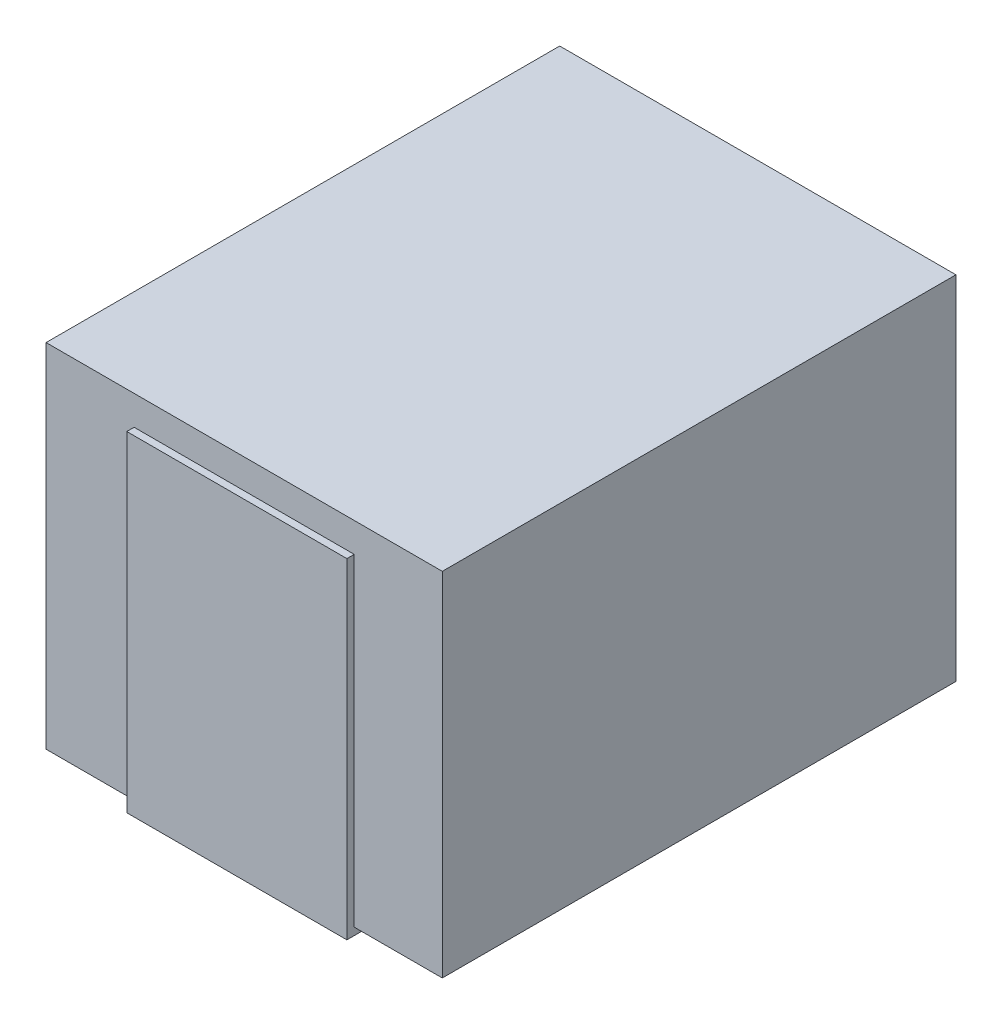
ISO-10303-21;
HEADER;
FILE_DESCRIPTION(('STEP AP214'),'2;1');
FILE_NAME('part.step','',(''),(''),'','','');
FILE_SCHEMA(('AUTOMOTIVE_DESIGN { 1 0 10303 214 1 1 1 1 }'));
ENDSEC;
DATA;
#1=APPLICATION_CONTEXT('core data for automotive mechanical design processes');
#2=APPLICATION_PROTOCOL_DEFINITION('international standard','automotive_design',2000,#1);
#3=PRODUCT_CONTEXT('',#1,'mechanical');
#4=PRODUCT('Part','Part','',(#3));
#5=PRODUCT_RELATED_PRODUCT_CATEGORY('part','',(#4));
#6=PRODUCT_DEFINITION_FORMATION('','',#4);
#7=PRODUCT_DEFINITION_CONTEXT('part definition',#1,'design');
#8=PRODUCT_DEFINITION('design','',#6,#7);
#9=PRODUCT_DEFINITION_SHAPE('','',#8);
#10=(LENGTH_UNIT() NAMED_UNIT(*) SI_UNIT(.MILLI.,.METRE.));
#11=(NAMED_UNIT(*) PLANE_ANGLE_UNIT() SI_UNIT($,.RADIAN.));
#12=(NAMED_UNIT(*) SI_UNIT($,.STERADIAN.) SOLID_ANGLE_UNIT());
#13=UNCERTAINTY_MEASURE_WITH_UNIT(LENGTH_MEASURE(1.E-05),#10,'distance_accuracy_value','');
#14=(GEOMETRIC_REPRESENTATION_CONTEXT(3) GLOBAL_UNCERTAINTY_ASSIGNED_CONTEXT((#13)) GLOBAL_UNIT_ASSIGNED_CONTEXT((#10,
#11,#12)) REPRESENTATION_CONTEXT('',''));
#15=CARTESIAN_POINT('',(0.,0.,0.));
#16=DIRECTION('',(0.,0.,1.));
#17=DIRECTION('',(1.,0.,0.));
#18=AXIS2_PLACEMENT_3D('',#15,#16,#17);
#19=CARTESIAN_POINT('',(0.75,2.2,1.8));
#20=DIRECTION('',(0.,0.,-1.));
#21=DIRECTION('',(-1.,0.,0.));
#22=AXIS2_PLACEMENT_3D('',#19,#20,#21);
#23=PLANE('',#22);
#24=DIRECTION('',(1.,0.,0.));
#25=VECTOR('',#24,1.);
#26=CARTESIAN_POINT('',(0.75,-0.05,1.8));
#27=LINE('',#26,#25);
#28=CARTESIAN_POINT('',(-0.75,-0.0500000000000001,1.8));
#29=VERTEX_POINT('',#28);
#30=CARTESIAN_POINT('',(0.75,-0.0500000000000001,1.8));
#31=VERTEX_POINT('',#30);
#32=EDGE_CURVE('E20',#29,#31,#27,.T.);
#33=ORIENTED_EDGE('',*,*,#32,.T.);
#34=DIRECTION('',(0.,1.,0.));
#35=VECTOR('',#34,1.);
#36=CARTESIAN_POINT('',(0.75,0.,1.8));
#37=LINE('',#36,#35);
#38=CARTESIAN_POINT('',(0.75,2.2,1.8));
#39=VERTEX_POINT('',#38);
#40=EDGE_CURVE('E120',#39,#31,#37,.F.);
#41=ORIENTED_EDGE('',*,*,#40,.F.);
#42=DIRECTION('',(1.,0.,0.));
#43=VECTOR('',#42,1.);
#44=CARTESIAN_POINT('',(0.75,2.2,1.8));
#45=LINE('',#44,#43);
#46=CARTESIAN_POINT('',(-0.75,2.2,1.8));
#47=VERTEX_POINT('',#46);
#48=EDGE_CURVE('E108',#39,#47,#45,.F.);
#49=ORIENTED_EDGE('',*,*,#48,.T.);
#50=DIRECTION('',(0.,1.,0.));
#51=VECTOR('',#50,1.);
#52=CARTESIAN_POINT('',(-0.75,0.,1.8));
#53=LINE('',#52,#51);
#54=EDGE_CURVE('E160',#47,#29,#53,.F.);
#55=ORIENTED_EDGE('',*,*,#54,.T.);
#56=EDGE_LOOP('',(#33,#41,#49,#55));
#57=FACE_BOUND('',#56,.T.);
#58=ADVANCED_FACE('F17',(#57),#23,.F.);
#59=CARTESIAN_POINT('',(0.75,-0.05,1.75));
#60=DIRECTION('',(0.,1.,0.));
#61=DIRECTION('',(0.,0.,1.));
#62=AXIS2_PLACEMENT_3D('',#59,#60,#61);
#63=PLANE('',#62);
#64=DIRECTION('',(1.,0.,0.));
#65=VECTOR('',#64,1.);
#66=CARTESIAN_POINT('',(0.75,-0.05,-1.8));
#67=LINE('',#66,#65);
#68=CARTESIAN_POINT('',(-0.75,-0.05,-1.8));
#69=VERTEX_POINT('',#68);
#70=CARTESIAN_POINT('',(0.75,-0.05,-1.8));
#71=VERTEX_POINT('',#70);
#72=EDGE_CURVE('E141',#69,#71,#67,.T.);
#73=ORIENTED_EDGE('',*,*,#72,.T.);
#74=DIRECTION('',(0.,0.,-1.));
#75=VECTOR('',#74,1.);
#76=CARTESIAN_POINT('',(0.75,-0.05,1.75));
#77=LINE('',#76,#75);
#78=EDGE_CURVE('E123',#31,#71,#77,.T.);
#79=ORIENTED_EDGE('',*,*,#78,.F.);
#80=ORIENTED_EDGE('',*,*,#32,.F.);
#81=DIRECTION('',(0.,0.,-1.));
#82=VECTOR('',#81,1.);
#83=CARTESIAN_POINT('',(-0.75,-0.05,1.75));
#84=LINE('',#83,#82);
#85=EDGE_CURVE('E147',#29,#69,#84,.T.);
#86=ORIENTED_EDGE('',*,*,#85,.T.);
#87=EDGE_LOOP('',(#73,#79,#80,#86));
#88=FACE_BOUND('',#87,.T.);
#89=ADVANCED_FACE('F145',(#88),#63,.F.);
#90=CARTESIAN_POINT('',(0.75,0.,-1.8));
#91=DIRECTION('',(0.,0.,1.));
#92=DIRECTION('',(1.,0.,0.));
#93=AXIS2_PLACEMENT_3D('',#90,#91,#92);
#94=PLANE('',#93);
#95=DIRECTION('',(1.,0.,0.));
#96=VECTOR('',#95,1.);
#97=CARTESIAN_POINT('',(0.75,2.2,-1.8));
#98=LINE('',#97,#96);
#99=CARTESIAN_POINT('',(-0.75,2.2,-1.8));
#100=VERTEX_POINT('',#99);
#101=CARTESIAN_POINT('',(0.75,2.2,-1.8));
#102=VERTEX_POINT('',#101);
#103=EDGE_CURVE('E133',#100,#102,#98,.T.);
#104=ORIENTED_EDGE('',*,*,#103,.T.);
#105=DIRECTION('',(0.,1.,0.));
#106=VECTOR('',#105,1.);
#107=CARTESIAN_POINT('',(0.75,0.,-1.8));
#108=LINE('',#107,#106);
#109=EDGE_CURVE('E151',#71,#102,#108,.T.);
#110=ORIENTED_EDGE('',*,*,#109,.F.);
#111=ORIENTED_EDGE('',*,*,#72,.F.);
#112=DIRECTION('',(0.,1.,0.));
#113=VECTOR('',#112,1.);
#114=CARTESIAN_POINT('',(-0.75,0.,-1.8));
#115=LINE('',#114,#113);
#116=EDGE_CURVE('E163',#69,#100,#115,.T.);
#117=ORIENTED_EDGE('',*,*,#116,.T.);
#118=EDGE_LOOP('',(#104,#110,#111,#117));
#119=FACE_BOUND('',#118,.T.);
#120=ADVANCED_FACE('F152',(#119),#94,.F.);
#121=CARTESIAN_POINT('',(-1.35,0.,1.75));
#122=DIRECTION('',(0.,1.,0.));
#123=DIRECTION('',(0.,0.,1.));
#124=AXIS2_PLACEMENT_3D('',#121,#122,#123);
#125=PLANE('',#124);
#126=DIRECTION('',(1.,0.,0.));
#127=VECTOR('',#126,1.);
#128=CARTESIAN_POINT('',(-1.35,0.,1.75));
#129=LINE('',#128,#127);
#130=CARTESIAN_POINT('',(-1.35,0.,1.75));
#131=VERTEX_POINT('',#130);
#132=CARTESIAN_POINT('',(-0.75,0.,1.75));
#133=VERTEX_POINT('',#132);
#134=EDGE_CURVE('E117',#131,#133,#129,.T.);
#135=ORIENTED_EDGE('',*,*,#134,.F.);
#136=DIRECTION('',(0.,0.,-1.));
#137=VECTOR('',#136,1.);
#138=CARTESIAN_POINT('',(-1.35,0.,-1.75));
#139=LINE('',#138,#137);
#140=CARTESIAN_POINT('',(-1.35,0.,-1.75));
#141=VERTEX_POINT('',#140);
#142=EDGE_CURVE('E170',#131,#141,#139,.T.);
#143=ORIENTED_EDGE('',*,*,#142,.T.);
#144=DIRECTION('',(1.,0.,0.));
#145=VECTOR('',#144,1.);
#146=CARTESIAN_POINT('',(-1.35,0.,-1.75));
#147=LINE('',#146,#145);
#148=CARTESIAN_POINT('',(-0.75,0.,-1.75));
#149=VERTEX_POINT('',#148);
#150=EDGE_CURVE('E140',#149,#141,#147,.F.);
#151=ORIENTED_EDGE('',*,*,#150,.F.);
#152=DIRECTION('',(0.,0.,-1.));
#153=VECTOR('',#152,1.);
#154=CARTESIAN_POINT('',(-0.75,0.,1.75));
#155=LINE('',#154,#153);
#156=EDGE_CURVE('E167',#149,#133,#155,.F.);
#157=ORIENTED_EDGE('',*,*,#156,.T.);
#158=EDGE_LOOP('',(#135,#143,#151,#157));
#159=FACE_BOUND('',#158,.T.);
#160=ADVANCED_FACE('F230',(#159),#125,.F.);
#161=CARTESIAN_POINT('',(0.75,2.2,1.55));
#162=DIRECTION('',(0.,-1.,0.));
#163=DIRECTION('',(0.,0.,-1.));
#164=AXIS2_PLACEMENT_3D('',#161,#162,#163);
#165=PLANE('',#164);
#166=DIRECTION('',(0.,0.,-1.));
#167=VECTOR('',#166,1.);
#168=CARTESIAN_POINT('',(-0.75,2.2,1.75));
#169=LINE('',#168,#167);
#170=CARTESIAN_POINT('',(-0.75,2.2,1.75));
#171=VERTEX_POINT('',#170);
#172=EDGE_CURVE('E114',#171,#47,#169,.F.);
#173=ORIENTED_EDGE('',*,*,#172,.T.);
#174=ORIENTED_EDGE('',*,*,#48,.F.);
#175=DIRECTION('',(0.,0.,-1.));
#176=VECTOR('',#175,1.);
#177=CARTESIAN_POINT('',(0.75,2.2,1.75));
#178=LINE('',#177,#176);
#179=CARTESIAN_POINT('',(0.75,2.2,1.75));
#180=VERTEX_POINT('',#179);
#181=EDGE_CURVE('E111',#180,#39,#178,.F.);
#182=ORIENTED_EDGE('',*,*,#181,.F.);
#183=DIRECTION('',(-1.,0.,0.));
#184=VECTOR('',#183,1.);
#185=CARTESIAN_POINT('',(-1.35,2.2,1.75));
#186=LINE('',#185,#184);
#187=EDGE_CURVE('E178',#180,#171,#186,.T.);
#188=ORIENTED_EDGE('',*,*,#187,.T.);
#189=EDGE_LOOP('',(#173,#174,#182,#188));
#190=FACE_BOUND('',#189,.T.);
#191=ADVANCED_FACE('F109',(#190),#165,.F.);
#192=CARTESIAN_POINT('',(-1.35,0.,1.75));
#193=DIRECTION('',(0.,1.,0.));
#194=DIRECTION('',(0.,0.,1.));
#195=AXIS2_PLACEMENT_3D('',#192,#193,#194);
#196=PLANE('',#195);
#197=DIRECTION('',(0.,0.,-1.));
#198=VECTOR('',#197,1.);
#199=CARTESIAN_POINT('',(0.75,0.,1.75));
#200=LINE('',#199,#198);
#201=CARTESIAN_POINT('',(0.75,0.,-1.75));
#202=VERTEX_POINT('',#201);
#203=CARTESIAN_POINT('',(0.75,0.,1.75));
#204=VERTEX_POINT('',#203);
#205=EDGE_CURVE('E131',#202,#204,#200,.F.);
#206=ORIENTED_EDGE('',*,*,#205,.F.);
#207=DIRECTION('',(1.,0.,0.));
#208=VECTOR('',#207,1.);
#209=CARTESIAN_POINT('',(-1.35,0.,-1.75));
#210=LINE('',#209,#208);
#211=CARTESIAN_POINT('',(1.35,0.,-1.75));
#212=VERTEX_POINT('',#211);
#213=EDGE_CURVE('E116',#212,#202,#210,.F.);
#214=ORIENTED_EDGE('',*,*,#213,.F.);
#215=DIRECTION('',(0.,0.,1.));
#216=VECTOR('',#215,1.);
#217=CARTESIAN_POINT('',(1.35,0.,-1.75));
#218=LINE('',#217,#216);
#219=CARTESIAN_POINT('',(1.35,0.,1.75));
#220=VERTEX_POINT('',#219);
#221=EDGE_CURVE('E185',#212,#220,#218,.T.);
#222=ORIENTED_EDGE('',*,*,#221,.T.);
#223=DIRECTION('',(-1.,0.,0.));
#224=VECTOR('',#223,1.);
#225=CARTESIAN_POINT('',(-1.35,0.,1.75));
#226=LINE('',#225,#224);
#227=EDGE_CURVE('E175',#220,#204,#226,.T.);
#228=ORIENTED_EDGE('',*,*,#227,.T.);
#229=EDGE_LOOP('',(#206,#214,#222,#228));
#230=FACE_BOUND('',#229,.T.);
#231=ADVANCED_FACE('F217',(#230),#196,.F.);
#232=CARTESIAN_POINT('',(0.75,2.2,-1.55));
#233=DIRECTION('',(0.,-1.,0.));
#234=DIRECTION('',(0.,0.,-1.));
#235=AXIS2_PLACEMENT_3D('',#232,#233,#234);
#236=PLANE('',#235);
#237=DIRECTION('',(0.,0.,-1.));
#238=VECTOR('',#237,1.);
#239=CARTESIAN_POINT('',(0.75,2.2,1.75));
#240=LINE('',#239,#238);
#241=CARTESIAN_POINT('',(0.75,2.2,-1.75));
#242=VERTEX_POINT('',#241);
#243=EDGE_CURVE('E155',#102,#242,#240,.F.);
#244=ORIENTED_EDGE('',*,*,#243,.F.);
#245=ORIENTED_EDGE('',*,*,#103,.F.);
#246=DIRECTION('',(0.,0.,-1.));
#247=VECTOR('',#246,1.);
#248=CARTESIAN_POINT('',(-0.75,2.2,1.75));
#249=LINE('',#248,#247);
#250=CARTESIAN_POINT('',(-0.75,2.2,-1.75));
#251=VERTEX_POINT('',#250);
#252=EDGE_CURVE('E165',#100,#251,#249,.F.);
#253=ORIENTED_EDGE('',*,*,#252,.T.);
#254=DIRECTION('',(1.,0.,0.));
#255=VECTOR('',#254,1.);
#256=CARTESIAN_POINT('',(-1.35,2.2,-1.75));
#257=LINE('',#256,#255);
#258=EDGE_CURVE('E188',#251,#242,#257,.T.);
#259=ORIENTED_EDGE('',*,*,#258,.T.);
#260=EDGE_LOOP('',(#244,#245,#253,#259));
#261=FACE_BOUND('',#260,.T.);
#262=ADVANCED_FACE('F235',(#261),#236,.F.);
#263=CARTESIAN_POINT('',(0.75,0.,1.75));
#264=DIRECTION('',(1.,0.,0.));
#265=DIRECTION('',(0.,0.,-1.));
#266=AXIS2_PLACEMENT_3D('',#263,#264,#265);
#267=PLANE('',#266);
#268=ORIENTED_EDGE('',*,*,#243,.T.);
#269=DIRECTION('',(0.,1.,0.));
#270=VECTOR('',#269,1.);
#271=CARTESIAN_POINT('',(0.75,2.4,-1.75));
#272=LINE('',#271,#270);
#273=EDGE_CURVE('E190',#242,#202,#272,.F.);
#274=ORIENTED_EDGE('',*,*,#273,.T.);
#275=ORIENTED_EDGE('',*,*,#205,.T.);
#276=DIRECTION('',(0.,1.,0.));
#277=VECTOR('',#276,1.);
#278=CARTESIAN_POINT('',(0.75,2.4,1.75));
#279=LINE('',#278,#277);
#280=EDGE_CURVE('E129',#204,#180,#279,.T.);
#281=ORIENTED_EDGE('',*,*,#280,.T.);
#282=ORIENTED_EDGE('',*,*,#181,.T.);
#283=ORIENTED_EDGE('',*,*,#40,.T.);
#284=ORIENTED_EDGE('',*,*,#78,.T.);
#285=ORIENTED_EDGE('',*,*,#109,.T.);
#286=EDGE_LOOP('',(#268,#274,#275,#281,#282,#283,#284,#285));
#287=FACE_BOUND('',#286,.T.);
#288=ADVANCED_FACE('F126',(#287),#267,.T.);
#289=CARTESIAN_POINT('',(-0.75,0.,1.75));
#290=DIRECTION('',(1.,0.,0.));
#291=DIRECTION('',(0.,0.,-1.));
#292=AXIS2_PLACEMENT_3D('',#289,#290,#291);
#293=PLANE('',#292);
#294=ORIENTED_EDGE('',*,*,#156,.F.);
#295=DIRECTION('',(0.,1.,0.));
#296=VECTOR('',#295,1.);
#297=CARTESIAN_POINT('',(-0.75,2.4,-1.75));
#298=LINE('',#297,#296);
#299=EDGE_CURVE('E197',#149,#251,#298,.T.);
#300=ORIENTED_EDGE('',*,*,#299,.T.);
#301=ORIENTED_EDGE('',*,*,#252,.F.);
#302=ORIENTED_EDGE('',*,*,#116,.F.);
#303=ORIENTED_EDGE('',*,*,#85,.F.);
#304=ORIENTED_EDGE('',*,*,#54,.F.);
#305=ORIENTED_EDGE('',*,*,#172,.F.);
#306=DIRECTION('',(0.,1.,0.));
#307=VECTOR('',#306,1.);
#308=CARTESIAN_POINT('',(-0.75,2.4,1.75));
#309=LINE('',#308,#307);
#310=EDGE_CURVE('E180',#171,#133,#309,.F.);
#311=ORIENTED_EDGE('',*,*,#310,.T.);
#312=EDGE_LOOP('',(#294,#300,#301,#302,#303,#304,#305,#311));
#313=FACE_BOUND('',#312,.T.);
#314=ADVANCED_FACE('F232',(#313),#293,.F.);
#315=CARTESIAN_POINT('',(-1.35,2.4,-1.75));
#316=DIRECTION('',(1.,0.,0.));
#317=DIRECTION('',(0.,0.,-1.));
#318=AXIS2_PLACEMENT_3D('',#315,#316,#317);
#319=PLANE('',#318);
#320=DIRECTION('',(0.,1.,0.));
#321=VECTOR('',#320,1.);
#322=CARTESIAN_POINT('',(-1.35,2.4,1.75));
#323=LINE('',#322,#321);
#324=CARTESIAN_POINT('',(-1.35,2.4,1.75));
#325=VERTEX_POINT('',#324);
#326=EDGE_CURVE('E173',#131,#325,#323,.T.);
#327=ORIENTED_EDGE('',*,*,#326,.T.);
#328=DIRECTION('',(0.,0.,1.));
#329=VECTOR('',#328,1.);
#330=CARTESIAN_POINT('',(-1.35,2.4,1.75));
#331=LINE('',#330,#329);
#332=CARTESIAN_POINT('',(-1.35,2.4,-1.75));
#333=VERTEX_POINT('',#332);
#334=EDGE_CURVE('E200',#333,#325,#331,.T.);
#335=ORIENTED_EDGE('',*,*,#334,.F.);
#336=DIRECTION('',(0.,1.,0.));
#337=VECTOR('',#336,1.);
#338=CARTESIAN_POINT('',(-1.35,2.4,-1.75));
#339=LINE('',#338,#337);
#340=EDGE_CURVE('E194',#333,#141,#339,.F.);
#341=ORIENTED_EDGE('',*,*,#340,.T.);
#342=ORIENTED_EDGE('',*,*,#142,.F.);
#343=EDGE_LOOP('',(#327,#335,#341,#342));
#344=FACE_BOUND('',#343,.T.);
#345=ADVANCED_FACE('F226',(#344),#319,.F.);
#346=CARTESIAN_POINT('',(-1.35,2.4,1.75));
#347=DIRECTION('',(0.,0.,-1.));
#348=DIRECTION('',(-1.,0.,0.));
#349=AXIS2_PLACEMENT_3D('',#346,#347,#348);
#350=PLANE('',#349);
#351=ORIENTED_EDGE('',*,*,#187,.F.);
#352=ORIENTED_EDGE('',*,*,#280,.F.);
#353=ORIENTED_EDGE('',*,*,#227,.F.);
#354=DIRECTION('',(0.,1.,0.));
#355=VECTOR('',#354,1.);
#356=CARTESIAN_POINT('',(1.35,2.4,1.75));
#357=LINE('',#356,#355);
#358=CARTESIAN_POINT('',(1.35,2.4,1.75));
#359=VERTEX_POINT('',#358);
#360=EDGE_CURVE('E183',#220,#359,#357,.T.);
#361=ORIENTED_EDGE('',*,*,#360,.T.);
#362=DIRECTION('',(1.,0.,0.));
#363=VECTOR('',#362,1.);
#364=CARTESIAN_POINT('',(-1.35,2.4,1.75));
#365=LINE('',#364,#363);
#366=EDGE_CURVE('E203',#325,#359,#365,.T.);
#367=ORIENTED_EDGE('',*,*,#366,.F.);
#368=ORIENTED_EDGE('',*,*,#326,.F.);
#369=ORIENTED_EDGE('',*,*,#134,.T.);
#370=ORIENTED_EDGE('',*,*,#310,.F.);
#371=EDGE_LOOP('',(#351,#352,#353,#361,#367,#368,#369,#370));
#372=FACE_BOUND('',#371,.T.);
#373=ADVANCED_FACE('F213',(#372),#350,.F.);
#374=CARTESIAN_POINT('',(1.35,2.4,-1.75));
#375=DIRECTION('',(-1.,0.,0.));
#376=DIRECTION('',(0.,0.,1.));
#377=AXIS2_PLACEMENT_3D('',#374,#375,#376);
#378=PLANE('',#377);
#379=DIRECTION('',(0.,1.,0.));
#380=VECTOR('',#379,1.);
#381=CARTESIAN_POINT('',(1.35,2.4,-1.75));
#382=LINE('',#381,#380);
#383=CARTESIAN_POINT('',(1.35,2.4,-1.75));
#384=VERTEX_POINT('',#383);
#385=EDGE_CURVE('E35',#212,#384,#382,.T.);
#386=ORIENTED_EDGE('',*,*,#385,.T.);
#387=DIRECTION('',(0.,0.,1.));
#388=VECTOR('',#387,1.);
#389=CARTESIAN_POINT('',(1.35,2.4,1.75));
#390=LINE('',#389,#388);
#391=EDGE_CURVE('E26',#359,#384,#390,.F.);
#392=ORIENTED_EDGE('',*,*,#391,.F.);
#393=ORIENTED_EDGE('',*,*,#360,.F.);
#394=ORIENTED_EDGE('',*,*,#221,.F.);
#395=EDGE_LOOP('',(#386,#392,#393,#394));
#396=FACE_BOUND('',#395,.T.);
#397=ADVANCED_FACE('F211',(#396),#378,.F.);
#398=CARTESIAN_POINT('',(-1.35,2.4,-1.75));
#399=DIRECTION('',(0.,0.,1.));
#400=DIRECTION('',(1.,0.,0.));
#401=AXIS2_PLACEMENT_3D('',#398,#399,#400);
#402=PLANE('',#401);
#403=ORIENTED_EDGE('',*,*,#150,.T.);
#404=ORIENTED_EDGE('',*,*,#340,.F.);
#405=DIRECTION('',(1.,0.,0.));
#406=VECTOR('',#405,1.);
#407=CARTESIAN_POINT('',(-1.35,2.4,-1.75));
#408=LINE('',#407,#406);
#409=EDGE_CURVE('E11',#384,#333,#408,.F.);
#410=ORIENTED_EDGE('',*,*,#409,.F.);
#411=ORIENTED_EDGE('',*,*,#385,.F.);
#412=ORIENTED_EDGE('',*,*,#213,.T.);
#413=ORIENTED_EDGE('',*,*,#273,.F.);
#414=ORIENTED_EDGE('',*,*,#258,.F.);
#415=ORIENTED_EDGE('',*,*,#299,.F.);
#416=EDGE_LOOP('',(#403,#404,#410,#411,#412,#413,#414,#415));
#417=FACE_BOUND('',#416,.T.);
#418=ADVANCED_FACE('F220',(#417),#402,.F.);
#419=CARTESIAN_POINT('',(-1.35,2.4,1.75));
#420=DIRECTION('',(0.,1.,0.));
#421=DIRECTION('',(0.,0.,1.));
#422=AXIS2_PLACEMENT_3D('',#419,#420,#421);
#423=PLANE('',#422);
#424=ORIENTED_EDGE('',*,*,#391,.T.);
#425=ORIENTED_EDGE('',*,*,#409,.T.);
#426=ORIENTED_EDGE('',*,*,#334,.T.);
#427=ORIENTED_EDGE('',*,*,#366,.T.);
#428=EDGE_LOOP('',(#424,#425,#426,#427));
#429=FACE_BOUND('',#428,.T.);
#430=ADVANCED_FACE('F208',(#429),#423,.T.);
#431=CLOSED_SHELL('',(#58,#89,#120,#160,#191,#231,#262,#288,#314,#345,#373,#397,#418,#430));
#432=MANIFOLD_SOLID_BREP('B1',#431);
#433=ADVANCED_BREP_SHAPE_REPRESENTATION('',(#18,#432),#14);
#434=SHAPE_DEFINITION_REPRESENTATION(#9,#433);
ENDSEC;
END-ISO-10303-21;
